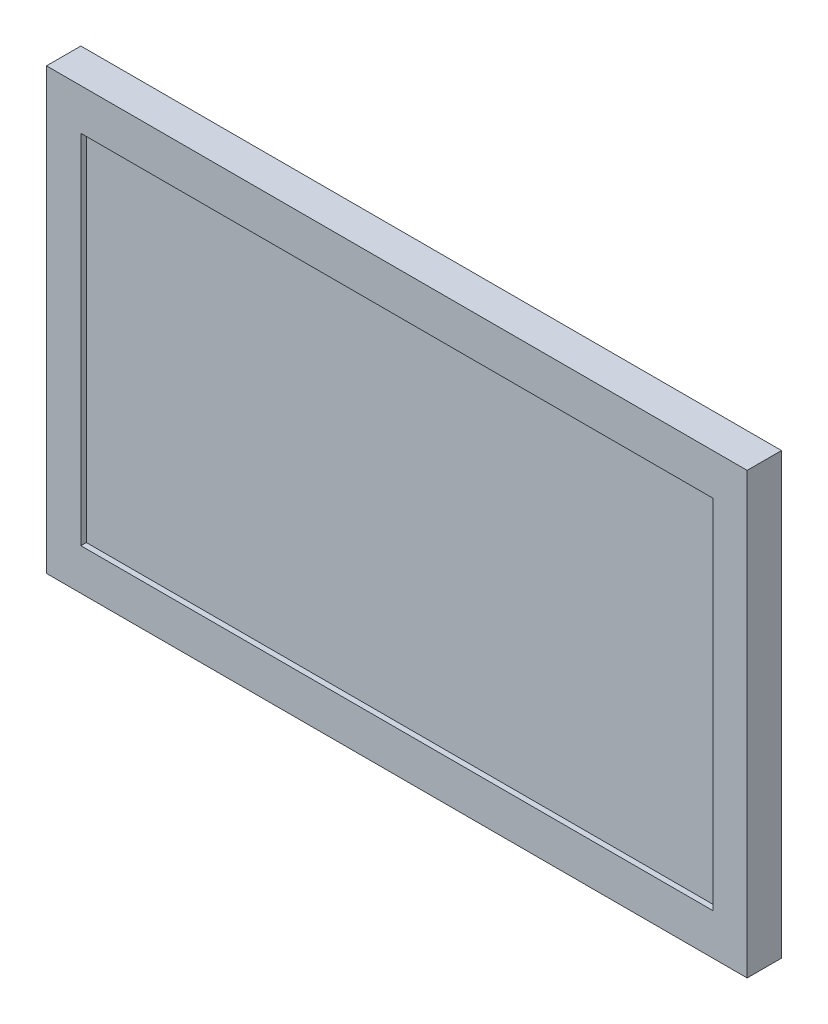
ISO-10303-21;
HEADER;
FILE_DESCRIPTION(('STEP AP214'),'2;1');
FILE_NAME('part.step','',(''),(''),'','','');
FILE_SCHEMA(('AUTOMOTIVE_DESIGN { 1 0 10303 214 1 1 1 1 }'));
ENDSEC;
DATA;
#1=APPLICATION_CONTEXT('core data for automotive mechanical design processes');
#2=APPLICATION_PROTOCOL_DEFINITION('international standard','automotive_design',2000,#1);
#3=PRODUCT_CONTEXT('',#1,'mechanical');
#4=PRODUCT('Part','Part','',(#3));
#5=PRODUCT_RELATED_PRODUCT_CATEGORY('part','',(#4));
#6=PRODUCT_DEFINITION_FORMATION('','',#4);
#7=PRODUCT_DEFINITION_CONTEXT('part definition',#1,'design');
#8=PRODUCT_DEFINITION('design','',#6,#7);
#9=PRODUCT_DEFINITION_SHAPE('','',#8);
#10=(LENGTH_UNIT() NAMED_UNIT(*) SI_UNIT(.MILLI.,.METRE.));
#11=(NAMED_UNIT(*) PLANE_ANGLE_UNIT() SI_UNIT($,.RADIAN.));
#12=(NAMED_UNIT(*) SI_UNIT($,.STERADIAN.) SOLID_ANGLE_UNIT());
#13=UNCERTAINTY_MEASURE_WITH_UNIT(LENGTH_MEASURE(1.E-05),#10,'distance_accuracy_value','');
#14=(GEOMETRIC_REPRESENTATION_CONTEXT(3) GLOBAL_UNCERTAINTY_ASSIGNED_CONTEXT((#13)) GLOBAL_UNIT_ASSIGNED_CONTEXT((#10,
#11,#12)) REPRESENTATION_CONTEXT('',''));
#15=CARTESIAN_POINT('',(0.,0.,0.));
#16=DIRECTION('',(0.,0.,1.));
#17=DIRECTION('',(1.,0.,0.));
#18=AXIS2_PLACEMENT_3D('',#15,#16,#17);
#19=CARTESIAN_POINT('',(161.925,-101.6,15.875));
#20=DIRECTION('',(-1.,0.,0.));
#21=DIRECTION('',(0.,0.,1.));
#22=AXIS2_PLACEMENT_3D('',#19,#20,#21);
#23=PLANE('',#22);
#24=DIRECTION('',(0.,1.,0.));
#25=VECTOR('',#24,1.);
#26=CARTESIAN_POINT('',(161.925,-101.6,0.));
#27=LINE('',#26,#25);
#28=CARTESIAN_POINT('',(161.925,-101.6,0.));
#29=VERTEX_POINT('',#28);
#30=CARTESIAN_POINT('',(161.925,101.6,0.));
#31=VERTEX_POINT('',#30);
#32=EDGE_CURVE('E167',#29,#31,#27,.T.);
#33=ORIENTED_EDGE('',*,*,#32,.T.);
#34=DIRECTION('',(0.,0.,-1.));
#35=VECTOR('',#34,1.);
#36=CARTESIAN_POINT('',(161.925,101.6,15.875));
#37=LINE('',#36,#35);
#38=CARTESIAN_POINT('',(161.925,101.6,15.875));
#39=VERTEX_POINT('',#38);
#40=EDGE_CURVE('E11',#39,#31,#37,.T.);
#41=ORIENTED_EDGE('',*,*,#40,.F.);
#42=DIRECTION('',(0.,1.,0.));
#43=VECTOR('',#42,1.);
#44=CARTESIAN_POINT('',(161.925,-101.6,15.875));
#45=LINE('',#44,#43);
#46=CARTESIAN_POINT('',(161.925,-101.6,15.875));
#47=VERTEX_POINT('',#46);
#48=EDGE_CURVE('E173',#47,#39,#45,.T.);
#49=ORIENTED_EDGE('',*,*,#48,.F.);
#50=DIRECTION('',(0.,0.,-1.));
#51=VECTOR('',#50,1.);
#52=CARTESIAN_POINT('',(161.925,-101.6,15.875));
#53=LINE('',#52,#51);
#54=EDGE_CURVE('E183',#47,#29,#53,.T.);
#55=ORIENTED_EDGE('',*,*,#54,.T.);
#56=EDGE_LOOP('',(#33,#41,#49,#55));
#57=FACE_BOUND('',#56,.T.);
#58=ADVANCED_FACE('F44',(#57),#23,.F.);
#59=CARTESIAN_POINT('',(-161.925,101.6,15.875));
#60=DIRECTION('',(0.,-1.,0.));
#61=DIRECTION('',(0.,0.,-1.));
#62=AXIS2_PLACEMENT_3D('',#59,#60,#61);
#63=PLANE('',#62);
#64=DIRECTION('',(-1.,0.,0.));
#65=VECTOR('',#64,1.);
#66=CARTESIAN_POINT('',(-161.925,101.6,0.));
#67=LINE('',#66,#65);
#68=CARTESIAN_POINT('',(-161.925,101.6,0.));
#69=VERTEX_POINT('',#68);
#70=EDGE_CURVE('E187',#31,#69,#67,.T.);
#71=ORIENTED_EDGE('',*,*,#70,.T.);
#72=DIRECTION('',(0.,0.,-1.));
#73=VECTOR('',#72,1.);
#74=CARTESIAN_POINT('',(-161.925,101.6,15.875));
#75=LINE('',#74,#73);
#76=CARTESIAN_POINT('',(-161.925,101.6,15.875));
#77=VERTEX_POINT('',#76);
#78=EDGE_CURVE('E52',#77,#69,#75,.T.);
#79=ORIENTED_EDGE('',*,*,#78,.F.);
#80=DIRECTION('',(-1.,0.,0.));
#81=VECTOR('',#80,1.);
#82=CARTESIAN_POINT('',(-161.925,101.6,15.875));
#83=LINE('',#82,#81);
#84=EDGE_CURVE('E96',#39,#77,#83,.T.);
#85=ORIENTED_EDGE('',*,*,#84,.F.);
#86=ORIENTED_EDGE('',*,*,#40,.T.);
#87=EDGE_LOOP('',(#71,#79,#85,#86));
#88=FACE_BOUND('',#87,.T.);
#89=ADVANCED_FACE('F222',(#88),#63,.F.);
#90=CARTESIAN_POINT('',(-161.925,-101.6,15.875));
#91=DIRECTION('',(1.,0.,0.));
#92=DIRECTION('',(0.,0.,-1.));
#93=AXIS2_PLACEMENT_3D('',#90,#91,#92);
#94=PLANE('',#93);
#95=DIRECTION('',(0.,-1.,0.));
#96=VECTOR('',#95,1.);
#97=CARTESIAN_POINT('',(-161.925,-101.6,0.));
#98=LINE('',#97,#96);
#99=CARTESIAN_POINT('',(-161.925,-101.6,0.));
#100=VERTEX_POINT('',#99);
#101=EDGE_CURVE('E190',#69,#100,#98,.T.);
#102=ORIENTED_EDGE('',*,*,#101,.T.);
#103=DIRECTION('',(0.,0.,-1.));
#104=VECTOR('',#103,1.);
#105=CARTESIAN_POINT('',(-161.925,-101.6,15.875));
#106=LINE('',#105,#104);
#107=CARTESIAN_POINT('',(-161.925,-101.6,15.875));
#108=VERTEX_POINT('',#107);
#109=EDGE_CURVE('E197',#108,#100,#106,.T.);
#110=ORIENTED_EDGE('',*,*,#109,.F.);
#111=DIRECTION('',(0.,-1.,0.));
#112=VECTOR('',#111,1.);
#113=CARTESIAN_POINT('',(-161.925,-101.6,15.875));
#114=LINE('',#113,#112);
#115=EDGE_CURVE('E178',#77,#108,#114,.T.);
#116=ORIENTED_EDGE('',*,*,#115,.F.);
#117=ORIENTED_EDGE('',*,*,#78,.T.);
#118=EDGE_LOOP('',(#102,#110,#116,#117));
#119=FACE_BOUND('',#118,.T.);
#120=ADVANCED_FACE('F204',(#119),#94,.F.);
#121=CARTESIAN_POINT('',(-161.925,-101.6,15.875));
#122=DIRECTION('',(0.,1.,0.));
#123=DIRECTION('',(0.,0.,1.));
#124=AXIS2_PLACEMENT_3D('',#121,#122,#123);
#125=PLANE('',#124);
#126=DIRECTION('',(1.,0.,0.));
#127=VECTOR('',#126,1.);
#128=CARTESIAN_POINT('',(-161.925,-101.6,0.));
#129=LINE('',#128,#127);
#130=EDGE_CURVE('E89',#100,#29,#129,.T.);
#131=ORIENTED_EDGE('',*,*,#130,.T.);
#132=ORIENTED_EDGE('',*,*,#54,.F.);
#133=DIRECTION('',(1.,0.,0.));
#134=VECTOR('',#133,1.);
#135=CARTESIAN_POINT('',(-161.925,-101.6,15.875));
#136=LINE('',#135,#134);
#137=EDGE_CURVE('E68',#108,#47,#136,.T.);
#138=ORIENTED_EDGE('',*,*,#137,.F.);
#139=ORIENTED_EDGE('',*,*,#109,.T.);
#140=EDGE_LOOP('',(#131,#132,#138,#139));
#141=FACE_BOUND('',#140,.T.);
#142=ADVANCED_FACE('F212',(#141),#125,.F.);
#143=CARTESIAN_POINT('',(0.,0.,15.875));
#144=DIRECTION('',(0.,0.,-1.));
#145=DIRECTION('',(-1.,0.,0.));
#146=AXIS2_PLACEMENT_3D('',#143,#144,#145);
#147=PLANE('',#146);
#148=DIRECTION('',(-1.,0.,0.));
#149=VECTOR('',#148,1.);
#150=CARTESIAN_POINT('',(-146.05,82.55,15.875));
#151=LINE('',#150,#149);
#152=CARTESIAN_POINT('',(146.05,82.55,15.875));
#153=VERTEX_POINT('',#152);
#154=CARTESIAN_POINT('',(-146.05,82.55,15.875));
#155=VERTEX_POINT('',#154);
#156=EDGE_CURVE('E157',#153,#155,#151,.T.);
#157=ORIENTED_EDGE('',*,*,#156,.F.);
#158=DIRECTION('',(0.,1.,0.));
#159=VECTOR('',#158,1.);
#160=CARTESIAN_POINT('',(146.05,-82.55,15.875));
#161=LINE('',#160,#159);
#162=CARTESIAN_POINT('',(146.05,-82.55,15.875));
#163=VERTEX_POINT('',#162);
#164=EDGE_CURVE('E59',#163,#153,#161,.T.);
#165=ORIENTED_EDGE('',*,*,#164,.F.);
#166=DIRECTION('',(1.,0.,0.));
#167=VECTOR('',#166,1.);
#168=CARTESIAN_POINT('',(-146.05,-82.55,15.875));
#169=LINE('',#168,#167);
#170=CARTESIAN_POINT('',(-146.05,-82.55,15.875));
#171=VERTEX_POINT('',#170);
#172=EDGE_CURVE('E141',#171,#163,#169,.T.);
#173=ORIENTED_EDGE('',*,*,#172,.F.);
#174=DIRECTION('',(0.,-1.,0.));
#175=VECTOR('',#174,1.);
#176=CARTESIAN_POINT('',(-146.05,-82.55,15.875));
#177=LINE('',#176,#175);
#178=EDGE_CURVE('E145',#155,#171,#177,.T.);
#179=ORIENTED_EDGE('',*,*,#178,.F.);
#180=EDGE_LOOP('',(#157,#165,#173,#179));
#181=FACE_BOUND('',#180,.T.);
#182=ORIENTED_EDGE('',*,*,#48,.T.);
#183=ORIENTED_EDGE('',*,*,#84,.T.);
#184=ORIENTED_EDGE('',*,*,#115,.T.);
#185=ORIENTED_EDGE('',*,*,#137,.T.);
#186=EDGE_LOOP('',(#182,#183,#184,#185));
#187=FACE_BOUND('',#186,.T.);
#188=ADVANCED_FACE('F214',(#181,#187),#147,.F.);
#189=CARTESIAN_POINT('',(0.,0.,0.));
#190=DIRECTION('',(0.,0.,-1.));
#191=DIRECTION('',(-1.,0.,0.));
#192=AXIS2_PLACEMENT_3D('',#189,#190,#191);
#193=PLANE('',#192);
#194=CARTESIAN_POINT('',(37.5,-37.5,0.));
#195=DIRECTION('',(0.,0.,-1.));
#196=DIRECTION('',(-1.,0.,0.));
#197=AXIS2_PLACEMENT_3D('',#194,#195,#196);
#198=CIRCLE('',#197,2.3749);
#199=CARTESIAN_POINT('',(35.1251,-37.5,0.));
#200=VERTEX_POINT('',#199);
#201=EDGE_CURVE('E430',#200,#200,#198,.T.);
#202=ORIENTED_EDGE('',*,*,#201,.F.);
#203=EDGE_LOOP('',(#202));
#204=FACE_BOUND('',#203,.T.);
#205=CARTESIAN_POINT('',(-37.5,-37.5,0.));
#206=DIRECTION('',(0.,0.,-1.));
#207=DIRECTION('',(-1.,0.,0.));
#208=AXIS2_PLACEMENT_3D('',#205,#206,#207);
#209=CIRCLE('',#208,2.3749);
#210=CARTESIAN_POINT('',(-39.8749,-37.5,0.));
#211=VERTEX_POINT('',#210);
#212=EDGE_CURVE('E453',#211,#211,#209,.T.);
#213=ORIENTED_EDGE('',*,*,#212,.F.);
#214=EDGE_LOOP('',(#213));
#215=FACE_BOUND('',#214,.T.);
#216=CARTESIAN_POINT('',(-37.5,37.5,0.));
#217=DIRECTION('',(0.,0.,-1.));
#218=DIRECTION('',(-1.,0.,0.));
#219=AXIS2_PLACEMENT_3D('',#216,#217,#218);
#220=CIRCLE('',#219,2.3749);
#221=CARTESIAN_POINT('',(-39.8749,37.5,0.));
#222=VERTEX_POINT('',#221);
#223=EDGE_CURVE('E442',#222,#222,#220,.T.);
#224=ORIENTED_EDGE('',*,*,#223,.F.);
#225=EDGE_LOOP('',(#224));
#226=FACE_BOUND('',#225,.T.);
#227=CARTESIAN_POINT('',(37.5,37.5,0.));
#228=DIRECTION('',(0.,0.,-1.));
#229=DIRECTION('',(-1.,0.,0.));
#230=AXIS2_PLACEMENT_3D('',#227,#228,#229);
#231=CIRCLE('',#230,2.3749);
#232=CARTESIAN_POINT('',(35.1251,37.5,0.));
#233=VERTEX_POINT('',#232);
#234=EDGE_CURVE('E148',#233,#233,#231,.T.);
#235=ORIENTED_EDGE('',*,*,#234,.F.);
#236=EDGE_LOOP('',(#235));
#237=FACE_BOUND('',#236,.T.);
#238=ORIENTED_EDGE('',*,*,#32,.F.);
#239=ORIENTED_EDGE('',*,*,#130,.F.);
#240=ORIENTED_EDGE('',*,*,#101,.F.);
#241=ORIENTED_EDGE('',*,*,#70,.F.);
#242=EDGE_LOOP('',(#238,#239,#240,#241));
#243=FACE_BOUND('',#242,.T.);
#244=ADVANCED_FACE('F208',(#204,#215,#226,#237,#243),#193,.T.);
#245=CARTESIAN_POINT('',(146.05,-82.55,13.335));
#246=DIRECTION('',(1.,0.,0.));
#247=DIRECTION('',(0.,0.,-1.));
#248=AXIS2_PLACEMENT_3D('',#245,#246,#247);
#249=PLANE('',#248);
#250=ORIENTED_EDGE('',*,*,#164,.T.);
#251=DIRECTION('',(0.,0.,1.));
#252=VECTOR('',#251,1.);
#253=CARTESIAN_POINT('',(146.05,82.55,13.335));
#254=LINE('',#253,#252);
#255=CARTESIAN_POINT('',(146.05,82.55,13.335));
#256=VERTEX_POINT('',#255);
#257=EDGE_CURVE('E116',#256,#153,#254,.T.);
#258=ORIENTED_EDGE('',*,*,#257,.F.);
#259=DIRECTION('',(0.,1.,0.));
#260=VECTOR('',#259,1.);
#261=CARTESIAN_POINT('',(146.05,-82.55,13.335));
#262=LINE('',#261,#260);
#263=CARTESIAN_POINT('',(146.05,-82.55,13.335));
#264=VERTEX_POINT('',#263);
#265=EDGE_CURVE('E120',#264,#256,#262,.T.);
#266=ORIENTED_EDGE('',*,*,#265,.F.);
#267=DIRECTION('',(0.,0.,1.));
#268=VECTOR('',#267,1.);
#269=CARTESIAN_POINT('',(146.05,-82.55,13.335));
#270=LINE('',#269,#268);
#271=EDGE_CURVE('E164',#264,#163,#270,.T.);
#272=ORIENTED_EDGE('',*,*,#271,.T.);
#273=EDGE_LOOP('',(#250,#258,#266,#272));
#274=FACE_BOUND('',#273,.T.);
#275=ADVANCED_FACE('F118',(#274),#249,.F.);
#276=CARTESIAN_POINT('',(-146.05,-82.55,13.335));
#277=DIRECTION('',(0.,-1.,0.));
#278=DIRECTION('',(0.,0.,-1.));
#279=AXIS2_PLACEMENT_3D('',#276,#277,#278);
#280=PLANE('',#279);
#281=ORIENTED_EDGE('',*,*,#172,.T.);
#282=ORIENTED_EDGE('',*,*,#271,.F.);
#283=DIRECTION('',(1.,0.,0.));
#284=VECTOR('',#283,1.);
#285=CARTESIAN_POINT('',(-146.05,-82.55,13.335));
#286=LINE('',#285,#284);
#287=CARTESIAN_POINT('',(-146.05,-82.55,13.335));
#288=VERTEX_POINT('',#287);
#289=EDGE_CURVE('E127',#288,#264,#286,.T.);
#290=ORIENTED_EDGE('',*,*,#289,.F.);
#291=DIRECTION('',(0.,0.,1.));
#292=VECTOR('',#291,1.);
#293=CARTESIAN_POINT('',(-146.05,-82.55,13.335));
#294=LINE('',#293,#292);
#295=EDGE_CURVE('E168',#288,#171,#294,.T.);
#296=ORIENTED_EDGE('',*,*,#295,.T.);
#297=EDGE_LOOP('',(#281,#282,#290,#296));
#298=FACE_BOUND('',#297,.T.);
#299=ADVANCED_FACE('F259',(#298),#280,.F.);
#300=CARTESIAN_POINT('',(-146.05,-82.55,13.335));
#301=DIRECTION('',(-1.,0.,0.));
#302=DIRECTION('',(0.,0.,1.));
#303=AXIS2_PLACEMENT_3D('',#300,#301,#302);
#304=PLANE('',#303);
#305=ORIENTED_EDGE('',*,*,#178,.T.);
#306=ORIENTED_EDGE('',*,*,#295,.F.);
#307=DIRECTION('',(0.,-1.,0.));
#308=VECTOR('',#307,1.);
#309=CARTESIAN_POINT('',(-146.05,-82.55,13.335));
#310=LINE('',#309,#308);
#311=CARTESIAN_POINT('',(-146.05,82.55,13.335));
#312=VERTEX_POINT('',#311);
#313=EDGE_CURVE('E136',#312,#288,#310,.T.);
#314=ORIENTED_EDGE('',*,*,#313,.F.);
#315=DIRECTION('',(0.,0.,1.));
#316=VECTOR('',#315,1.);
#317=CARTESIAN_POINT('',(-146.05,82.55,13.335));
#318=LINE('',#317,#316);
#319=EDGE_CURVE('E126',#312,#155,#318,.T.);
#320=ORIENTED_EDGE('',*,*,#319,.T.);
#321=EDGE_LOOP('',(#305,#306,#314,#320));
#322=FACE_BOUND('',#321,.T.);
#323=ADVANCED_FACE('F269',(#322),#304,.F.);
#324=CARTESIAN_POINT('',(-146.05,82.55,13.335));
#325=DIRECTION('',(0.,1.,0.));
#326=DIRECTION('',(0.,0.,1.));
#327=AXIS2_PLACEMENT_3D('',#324,#325,#326);
#328=PLANE('',#327);
#329=ORIENTED_EDGE('',*,*,#156,.T.);
#330=ORIENTED_EDGE('',*,*,#319,.F.);
#331=DIRECTION('',(-1.,0.,0.));
#332=VECTOR('',#331,1.);
#333=CARTESIAN_POINT('',(-146.05,82.55,13.335));
#334=LINE('',#333,#332);
#335=EDGE_CURVE('E130',#256,#312,#334,.T.);
#336=ORIENTED_EDGE('',*,*,#335,.F.);
#337=ORIENTED_EDGE('',*,*,#257,.T.);
#338=EDGE_LOOP('',(#329,#330,#336,#337));
#339=FACE_BOUND('',#338,.T.);
#340=ADVANCED_FACE('F131',(#339),#328,.F.);
#341=CARTESIAN_POINT('',(0.,0.,13.335));
#342=DIRECTION('',(0.,0.,-1.));
#343=DIRECTION('',(-1.,0.,0.));
#344=AXIS2_PLACEMENT_3D('',#341,#342,#343);
#345=PLANE('',#344);
#346=ORIENTED_EDGE('',*,*,#265,.T.);
#347=ORIENTED_EDGE('',*,*,#335,.T.);
#348=ORIENTED_EDGE('',*,*,#313,.T.);
#349=ORIENTED_EDGE('',*,*,#289,.T.);
#350=EDGE_LOOP('',(#346,#347,#348,#349));
#351=FACE_BOUND('',#350,.T.);
#352=ADVANCED_FACE('F138',(#351),#345,.F.);
#353=CARTESIAN_POINT('',(37.5,37.5,2.54));
#354=DIRECTION('',(0.,0.,-1.));
#355=DIRECTION('',(-1.,0.,0.));
#356=AXIS2_PLACEMENT_3D('',#353,#354,#355);
#357=CYLINDRICAL_SURFACE('',#356,2.3749);
#358=CARTESIAN_POINT('',(37.5,37.5,2.54));
#359=DIRECTION('',(0.,0.,-1.));
#360=DIRECTION('',(-1.,0.,0.));
#361=AXIS2_PLACEMENT_3D('',#358,#359,#360);
#362=CIRCLE('',#361,2.3749);
#363=CARTESIAN_POINT('',(35.1251,37.5,2.54));
#364=VERTEX_POINT('',#363);
#365=EDGE_CURVE('E158',#364,#364,#362,.T.);
#366=ORIENTED_EDGE('',*,*,#365,.F.);
#367=EDGE_LOOP('',(#366));
#368=FACE_BOUND('',#367,.T.);
#369=ORIENTED_EDGE('',*,*,#234,.T.);
#370=EDGE_LOOP('',(#369));
#371=FACE_BOUND('',#370,.T.);
#372=ADVANCED_FACE('F300',(#368,#371),#357,.F.);
#373=CARTESIAN_POINT('',(37.5,37.5,2.54));
#374=DIRECTION('',(0.,0.,-1.));
#375=DIRECTION('',(-1.,0.,0.));
#376=AXIS2_PLACEMENT_3D('',#373,#374,#375);
#377=PLANE('',#376);
#378=ORIENTED_EDGE('',*,*,#365,.T.);
#379=EDGE_LOOP('',(#378));
#380=FACE_BOUND('',#379,.T.);
#381=ADVANCED_FACE('F314',(#380),#377,.T.);
#382=CARTESIAN_POINT('',(-37.5,37.5,2.54));
#383=DIRECTION('',(0.,0.,-1.));
#384=DIRECTION('',(-1.,0.,0.));
#385=AXIS2_PLACEMENT_3D('',#382,#383,#384);
#386=CYLINDRICAL_SURFACE('',#385,2.3749);
#387=CARTESIAN_POINT('',(-37.5,37.5,2.54));
#388=DIRECTION('',(0.,0.,-1.));
#389=DIRECTION('',(-1.,0.,0.));
#390=AXIS2_PLACEMENT_3D('',#387,#388,#389);
#391=CIRCLE('',#390,2.3749);
#392=CARTESIAN_POINT('',(-39.8749,37.5,2.54));
#393=VERTEX_POINT('',#392);
#394=EDGE_CURVE('E447',#393,#393,#391,.T.);
#395=ORIENTED_EDGE('',*,*,#394,.F.);
#396=EDGE_LOOP('',(#395));
#397=FACE_BOUND('',#396,.T.);
#398=ORIENTED_EDGE('',*,*,#223,.T.);
#399=EDGE_LOOP('',(#398));
#400=FACE_BOUND('',#399,.T.);
#401=ADVANCED_FACE('F325',(#397,#400),#386,.F.);
#402=CARTESIAN_POINT('',(-37.5,37.5,2.54));
#403=DIRECTION('',(0.,0.,-1.));
#404=DIRECTION('',(-1.,0.,0.));
#405=AXIS2_PLACEMENT_3D('',#402,#403,#404);
#406=PLANE('',#405);
#407=ORIENTED_EDGE('',*,*,#394,.T.);
#408=EDGE_LOOP('',(#407));
#409=FACE_BOUND('',#408,.T.);
#410=ADVANCED_FACE('F336',(#409),#406,.T.);
#411=CARTESIAN_POINT('',(-37.5,-37.5,2.54));
#412=DIRECTION('',(0.,0.,-1.));
#413=DIRECTION('',(-1.,0.,0.));
#414=AXIS2_PLACEMENT_3D('',#411,#412,#413);
#415=CYLINDRICAL_SURFACE('',#414,2.3749);
#416=CARTESIAN_POINT('',(-37.5,-37.5,2.54));
#417=DIRECTION('',(0.,0.,-1.));
#418=DIRECTION('',(-1.,0.,0.));
#419=AXIS2_PLACEMENT_3D('',#416,#417,#418);
#420=CIRCLE('',#419,2.3749);
#421=CARTESIAN_POINT('',(-39.8749,-37.5,2.54));
#422=VERTEX_POINT('',#421);
#423=EDGE_CURVE('E434',#422,#422,#420,.T.);
#424=ORIENTED_EDGE('',*,*,#423,.F.);
#425=EDGE_LOOP('',(#424));
#426=FACE_BOUND('',#425,.T.);
#427=ORIENTED_EDGE('',*,*,#212,.T.);
#428=EDGE_LOOP('',(#427));
#429=FACE_BOUND('',#428,.T.);
#430=ADVANCED_FACE('F347',(#426,#429),#415,.F.);
#431=CARTESIAN_POINT('',(-37.5,-37.5,2.54));
#432=DIRECTION('',(0.,0.,-1.));
#433=DIRECTION('',(-1.,0.,0.));
#434=AXIS2_PLACEMENT_3D('',#431,#432,#433);
#435=PLANE('',#434);
#436=ORIENTED_EDGE('',*,*,#423,.T.);
#437=EDGE_LOOP('',(#436));
#438=FACE_BOUND('',#437,.T.);
#439=ADVANCED_FACE('F358',(#438),#435,.T.);
#440=CARTESIAN_POINT('',(37.5,-37.5,2.54));
#441=DIRECTION('',(0.,0.,-1.));
#442=DIRECTION('',(-1.,0.,0.));
#443=AXIS2_PLACEMENT_3D('',#440,#441,#442);
#444=CYLINDRICAL_SURFACE('',#443,2.3749);
#445=CARTESIAN_POINT('',(37.5,-37.5,2.54));
#446=DIRECTION('',(0.,0.,-1.));
#447=DIRECTION('',(-1.,0.,0.));
#448=AXIS2_PLACEMENT_3D('',#445,#446,#447);
#449=CIRCLE('',#448,2.3749);
#450=CARTESIAN_POINT('',(35.1251,-37.5,2.54));
#451=VERTEX_POINT('',#450);
#452=EDGE_CURVE('E428',#451,#451,#449,.T.);
#453=ORIENTED_EDGE('',*,*,#452,.F.);
#454=EDGE_LOOP('',(#453));
#455=FACE_BOUND('',#454,.T.);
#456=ORIENTED_EDGE('',*,*,#201,.T.);
#457=EDGE_LOOP('',(#456));
#458=FACE_BOUND('',#457,.T.);
#459=ADVANCED_FACE('F369',(#455,#458),#444,.F.);
#460=CARTESIAN_POINT('',(37.5,-37.5,2.54));
#461=DIRECTION('',(0.,0.,-1.));
#462=DIRECTION('',(-1.,0.,0.));
#463=AXIS2_PLACEMENT_3D('',#460,#461,#462);
#464=PLANE('',#463);
#465=ORIENTED_EDGE('',*,*,#452,.T.);
#466=EDGE_LOOP('',(#465));
#467=FACE_BOUND('',#466,.T.);
#468=ADVANCED_FACE('F380',(#467),#464,.T.);
#469=CLOSED_SHELL('',(#58,#89,#120,#142,#188,#244,#275,#299,#323,#340,#352,#372,#381,#401,#410,
#430,#439,#459,#468));
#470=MANIFOLD_SOLID_BREP('B2',#469);
#471=ADVANCED_BREP_SHAPE_REPRESENTATION('',(#18,#470),#14);
#472=SHAPE_DEFINITION_REPRESENTATION(#9,#471);
ENDSEC;
END-ISO-10303-21;
